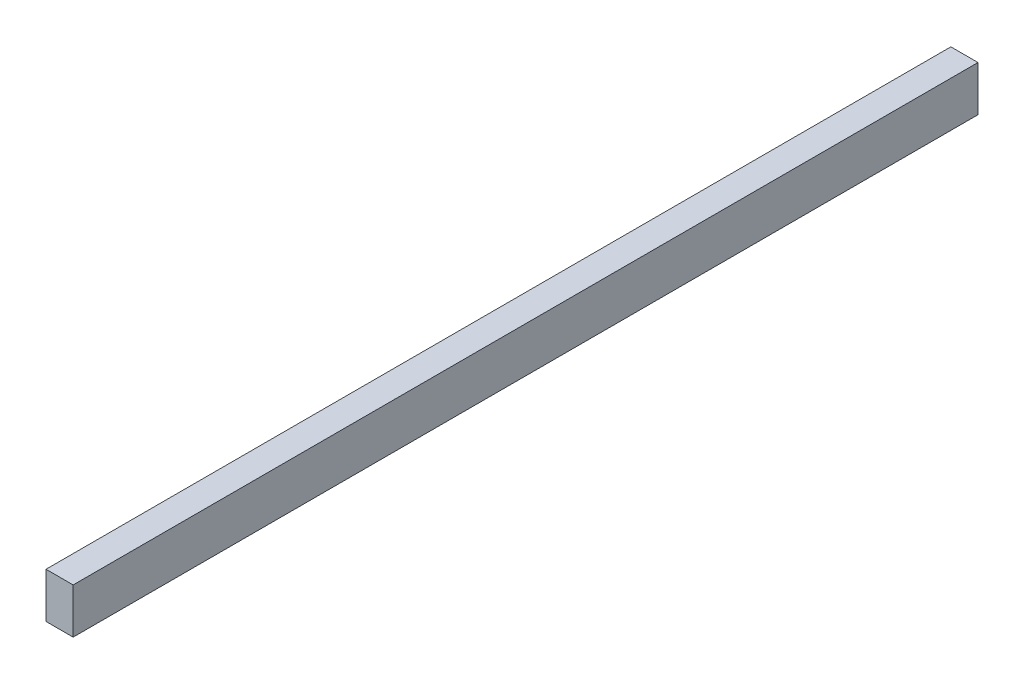
ISO-10303-21;
HEADER;
FILE_DESCRIPTION(('STEP AP214'),'2;1');
FILE_NAME('part.step','',(''),(''),'','','');
FILE_SCHEMA(('AUTOMOTIVE_DESIGN { 1 0 10303 214 1 1 1 1 }'));
ENDSEC;
DATA;
#1=APPLICATION_CONTEXT('core data for automotive mechanical design processes');
#2=APPLICATION_PROTOCOL_DEFINITION('international standard','automotive_design',2000,#1);
#3=PRODUCT_CONTEXT('',#1,'mechanical');
#4=PRODUCT('Part','Part','',(#3));
#5=PRODUCT_RELATED_PRODUCT_CATEGORY('part','',(#4));
#6=PRODUCT_DEFINITION_FORMATION('','',#4);
#7=PRODUCT_DEFINITION_CONTEXT('part definition',#1,'design');
#8=PRODUCT_DEFINITION('design','',#6,#7);
#9=PRODUCT_DEFINITION_SHAPE('','',#8);
#10=(LENGTH_UNIT() NAMED_UNIT(*) SI_UNIT(.MILLI.,.METRE.));
#11=(NAMED_UNIT(*) PLANE_ANGLE_UNIT() SI_UNIT($,.RADIAN.));
#12=(NAMED_UNIT(*) SI_UNIT($,.STERADIAN.) SOLID_ANGLE_UNIT());
#13=UNCERTAINTY_MEASURE_WITH_UNIT(LENGTH_MEASURE(1.E-05),#10,'distance_accuracy_value','');
#14=(GEOMETRIC_REPRESENTATION_CONTEXT(3) GLOBAL_UNCERTAINTY_ASSIGNED_CONTEXT((#13)) GLOBAL_UNIT_ASSIGNED_CONTEXT((#10,
#11,#12)) REPRESENTATION_CONTEXT('',''));
#15=CARTESIAN_POINT('',(0.,0.,0.));
#16=DIRECTION('',(0.,0.,1.));
#17=DIRECTION('',(1.,0.,0.));
#18=AXIS2_PLACEMENT_3D('',#15,#16,#17);
#19=CARTESIAN_POINT('',(6.,-10.,400.));
#20=DIRECTION('',(-1.,0.,0.));
#21=DIRECTION('',(0.,0.,1.));
#22=AXIS2_PLACEMENT_3D('',#19,#20,#21);
#23=PLANE('',#22);
#24=DIRECTION('',(0.,1.,0.));
#25=VECTOR('',#24,1.);
#26=CARTESIAN_POINT('',(6.,-10.,0.));
#27=LINE('',#26,#25);
#28=CARTESIAN_POINT('',(6.,-10.,0.));
#29=VERTEX_POINT('',#28);
#30=CARTESIAN_POINT('',(6.,10.,0.));
#31=VERTEX_POINT('',#30);
#32=EDGE_CURVE('E113',#29,#31,#27,.T.);
#33=ORIENTED_EDGE('',*,*,#32,.T.);
#34=DIRECTION('',(0.,0.,-1.));
#35=VECTOR('',#34,1.);
#36=CARTESIAN_POINT('',(6.,10.,400.));
#37=LINE('',#36,#35);
#38=CARTESIAN_POINT('',(6.,10.,400.));
#39=VERTEX_POINT('',#38);
#40=EDGE_CURVE('E11',#39,#31,#37,.T.);
#41=ORIENTED_EDGE('',*,*,#40,.F.);
#42=DIRECTION('',(0.,1.,0.));
#43=VECTOR('',#42,1.);
#44=CARTESIAN_POINT('',(6.,-10.,400.));
#45=LINE('',#44,#43);
#46=CARTESIAN_POINT('',(6.,-10.,400.));
#47=VERTEX_POINT('',#46);
#48=EDGE_CURVE('E97',#47,#39,#45,.T.);
#49=ORIENTED_EDGE('',*,*,#48,.F.);
#50=DIRECTION('',(0.,0.,-1.));
#51=VECTOR('',#50,1.);
#52=CARTESIAN_POINT('',(6.,-10.,400.));
#53=LINE('',#52,#51);
#54=EDGE_CURVE('E109',#47,#29,#53,.T.);
#55=ORIENTED_EDGE('',*,*,#54,.T.);
#56=EDGE_LOOP('',(#33,#41,#49,#55));
#57=FACE_BOUND('',#56,.T.);
#58=ADVANCED_FACE('F45',(#57),#23,.F.);
#59=CARTESIAN_POINT('',(-6.,10.,400.));
#60=DIRECTION('',(0.,-1.,0.));
#61=DIRECTION('',(1.,0.,0.));
#62=AXIS2_PLACEMENT_3D('',#59,#60,#61);
#63=PLANE('',#62);
#64=DIRECTION('',(-1.,0.,0.));
#65=VECTOR('',#64,1.);
#66=CARTESIAN_POINT('',(-6.,10.,0.));
#67=LINE('',#66,#65);
#68=CARTESIAN_POINT('',(-6.,10.,0.));
#69=VERTEX_POINT('',#68);
#70=EDGE_CURVE('E102',#31,#69,#67,.T.);
#71=ORIENTED_EDGE('',*,*,#70,.T.);
#72=DIRECTION('',(0.,0.,-1.));
#73=VECTOR('',#72,1.);
#74=CARTESIAN_POINT('',(-6.,10.,400.));
#75=LINE('',#74,#73);
#76=CARTESIAN_POINT('',(-6.,10.,400.));
#77=VERTEX_POINT('',#76);
#78=EDGE_CURVE('E54',#77,#69,#75,.T.);
#79=ORIENTED_EDGE('',*,*,#78,.F.);
#80=DIRECTION('',(-1.,0.,0.));
#81=VECTOR('',#80,1.);
#82=CARTESIAN_POINT('',(-6.,10.,400.));
#83=LINE('',#82,#81);
#84=EDGE_CURVE('E92',#39,#77,#83,.T.);
#85=ORIENTED_EDGE('',*,*,#84,.F.);
#86=ORIENTED_EDGE('',*,*,#40,.T.);
#87=EDGE_LOOP('',(#71,#79,#85,#86));
#88=FACE_BOUND('',#87,.T.);
#89=ADVANCED_FACE('F101',(#88),#63,.F.);
#90=CARTESIAN_POINT('',(-6.,-10.,400.));
#91=DIRECTION('',(1.,0.,0.));
#92=DIRECTION('',(0.,1.,0.));
#93=AXIS2_PLACEMENT_3D('',#90,#91,#92);
#94=PLANE('',#93);
#95=DIRECTION('',(0.,-1.,0.));
#96=VECTOR('',#95,1.);
#97=CARTESIAN_POINT('',(-6.,-10.,0.));
#98=LINE('',#97,#96);
#99=CARTESIAN_POINT('',(-6.,-10.,0.));
#100=VERTEX_POINT('',#99);
#101=EDGE_CURVE('E79',#69,#100,#98,.T.);
#102=ORIENTED_EDGE('',*,*,#101,.T.);
#103=DIRECTION('',(0.,0.,-1.));
#104=VECTOR('',#103,1.);
#105=CARTESIAN_POINT('',(-6.,-10.,400.));
#106=LINE('',#105,#104);
#107=CARTESIAN_POINT('',(-6.,-10.,400.));
#108=VERTEX_POINT('',#107);
#109=EDGE_CURVE('E104',#108,#100,#106,.T.);
#110=ORIENTED_EDGE('',*,*,#109,.F.);
#111=DIRECTION('',(0.,-1.,0.));
#112=VECTOR('',#111,1.);
#113=CARTESIAN_POINT('',(-6.,-10.,400.));
#114=LINE('',#113,#112);
#115=EDGE_CURVE('E95',#77,#108,#114,.T.);
#116=ORIENTED_EDGE('',*,*,#115,.F.);
#117=ORIENTED_EDGE('',*,*,#78,.T.);
#118=EDGE_LOOP('',(#102,#110,#116,#117));
#119=FACE_BOUND('',#118,.T.);
#120=ADVANCED_FACE('F105',(#119),#94,.F.);
#121=CARTESIAN_POINT('',(-6.,-10.,400.));
#122=DIRECTION('',(0.,1.,0.));
#123=DIRECTION('',(-1.,0.,0.));
#124=AXIS2_PLACEMENT_3D('',#121,#122,#123);
#125=PLANE('',#124);
#126=DIRECTION('',(1.,0.,0.));
#127=VECTOR('',#126,1.);
#128=CARTESIAN_POINT('',(-6.,-10.,0.));
#129=LINE('',#128,#127);
#130=EDGE_CURVE('E85',#100,#29,#129,.T.);
#131=ORIENTED_EDGE('',*,*,#130,.T.);
#132=ORIENTED_EDGE('',*,*,#54,.F.);
#133=DIRECTION('',(1.,0.,0.));
#134=VECTOR('',#133,1.);
#135=CARTESIAN_POINT('',(-6.,-10.,400.));
#136=LINE('',#135,#134);
#137=EDGE_CURVE('E62',#108,#47,#136,.T.);
#138=ORIENTED_EDGE('',*,*,#137,.F.);
#139=ORIENTED_EDGE('',*,*,#109,.T.);
#140=EDGE_LOOP('',(#131,#132,#138,#139));
#141=FACE_BOUND('',#140,.T.);
#142=ADVANCED_FACE('F126',(#141),#125,.F.);
#143=CARTESIAN_POINT('',(0.,0.,400.));
#144=DIRECTION('',(0.,0.,-1.));
#145=DIRECTION('',(-1.,0.,0.));
#146=AXIS2_PLACEMENT_3D('',#143,#144,#145);
#147=PLANE('',#146);
#148=ORIENTED_EDGE('',*,*,#48,.T.);
#149=ORIENTED_EDGE('',*,*,#84,.T.);
#150=ORIENTED_EDGE('',*,*,#115,.T.);
#151=ORIENTED_EDGE('',*,*,#137,.T.);
#152=EDGE_LOOP('',(#148,#149,#150,#151));
#153=FACE_BOUND('',#152,.T.);
#154=ADVANCED_FACE('F93',(#153),#147,.F.);
#155=CARTESIAN_POINT('',(0.,0.,0.));
#156=DIRECTION('',(0.,0.,-1.));
#157=DIRECTION('',(-1.,0.,0.));
#158=AXIS2_PLACEMENT_3D('',#155,#156,#157);
#159=PLANE('',#158);
#160=ORIENTED_EDGE('',*,*,#32,.F.);
#161=ORIENTED_EDGE('',*,*,#130,.F.);
#162=ORIENTED_EDGE('',*,*,#101,.F.);
#163=ORIENTED_EDGE('',*,*,#70,.F.);
#164=EDGE_LOOP('',(#160,#161,#162,#163));
#165=FACE_BOUND('',#164,.T.);
#166=ADVANCED_FACE('F129',(#165),#159,.T.);
#167=CLOSED_SHELL('',(#58,#89,#120,#142,#154,#166));
#168=MANIFOLD_SOLID_BREP('B2',#167);
#169=ADVANCED_BREP_SHAPE_REPRESENTATION('',(#18,#168),#14);
#170=SHAPE_DEFINITION_REPRESENTATION(#9,#169);
ENDSEC;
END-ISO-10303-21;
